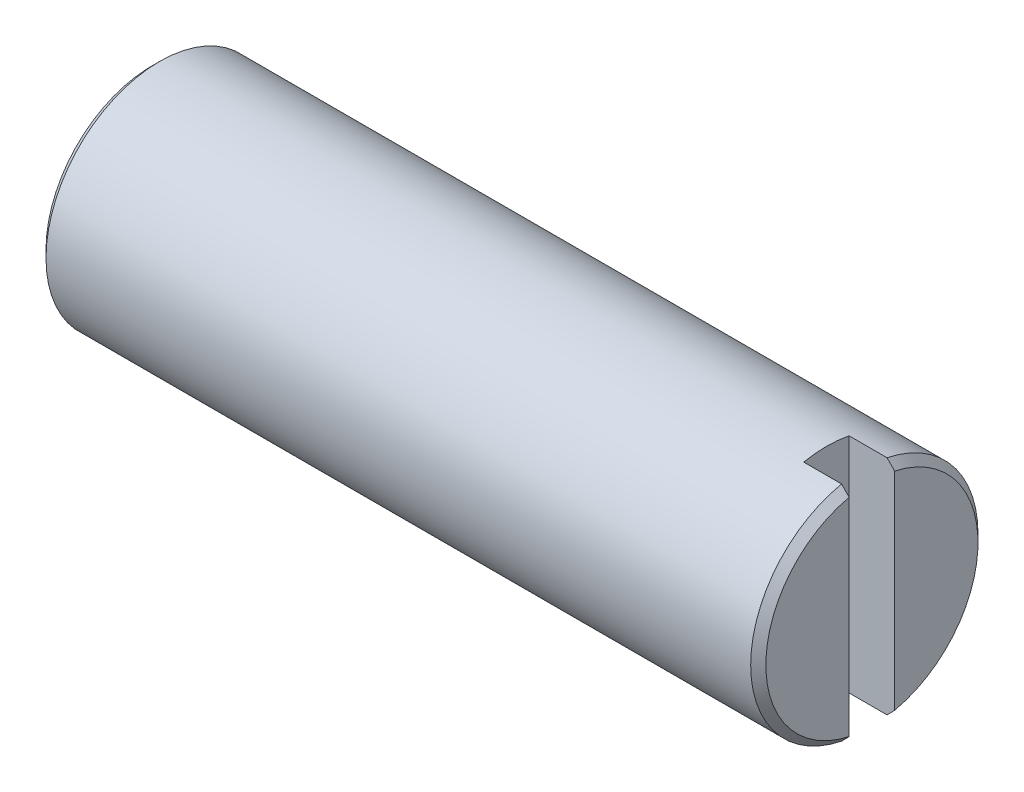
ISO-10303-21;
HEADER;
FILE_DESCRIPTION(('STEP AP214'),'2;1');
FILE_NAME('part.step','',(''),(''),'','','');
FILE_SCHEMA(('AUTOMOTIVE_DESIGN { 1 0 10303 214 1 1 1 1 }'));
ENDSEC;
DATA;
#1=APPLICATION_CONTEXT('core data for automotive mechanical design processes');
#2=APPLICATION_PROTOCOL_DEFINITION('international standard','automotive_design',2000,#1);
#3=PRODUCT_CONTEXT('',#1,'mechanical');
#4=PRODUCT('Part','Part','',(#3));
#5=PRODUCT_RELATED_PRODUCT_CATEGORY('part','',(#4));
#6=PRODUCT_DEFINITION_FORMATION('','',#4);
#7=PRODUCT_DEFINITION_CONTEXT('part definition',#1,'design');
#8=PRODUCT_DEFINITION('design','',#6,#7);
#9=PRODUCT_DEFINITION_SHAPE('','',#8);
#10=(LENGTH_UNIT() NAMED_UNIT(*) SI_UNIT(.MILLI.,.METRE.));
#11=(NAMED_UNIT(*) PLANE_ANGLE_UNIT() SI_UNIT($,.RADIAN.));
#12=(NAMED_UNIT(*) SI_UNIT($,.STERADIAN.) SOLID_ANGLE_UNIT());
#13=UNCERTAINTY_MEASURE_WITH_UNIT(LENGTH_MEASURE(1.E-05),#10,'distance_accuracy_value','');
#14=(GEOMETRIC_REPRESENTATION_CONTEXT(3) GLOBAL_UNCERTAINTY_ASSIGNED_CONTEXT((#13)) GLOBAL_UNIT_ASSIGNED_CONTEXT((#10,
#11,#12)) REPRESENTATION_CONTEXT('',''));
#15=CARTESIAN_POINT('',(0.,0.,0.));
#16=DIRECTION('',(0.,0.,1.));
#17=DIRECTION('',(1.,0.,0.));
#18=AXIS2_PLACEMENT_3D('',#15,#16,#17);
#19=CARTESIAN_POINT('',(0.,-13.674794331177,-65.3333333333324));
#20=DIRECTION('',(1.,0.,0.));
#21=DIRECTION('',(0.,1.,0.));
#22=AXIS2_PLACEMENT_3D('',#19,#20,#21);
#23=PLANE('',#22);
#24=CARTESIAN_POINT('',(0.,0.,0.));
#25=DIRECTION('',(-1.,0.,0.));
#26=DIRECTION('',(0.,0.,1.));
#27=AXIS2_PLACEMENT_3D('',#24,#25,#26);
#28=CIRCLE('',#27,14.);
#29=CARTESIAN_POINT('',(0.,-13.6747943311773,-3.));
#30=VERTEX_POINT('',#29);
#31=CARTESIAN_POINT('',(0.,13.6747943311774,-3.));
#32=VERTEX_POINT('',#31);
#33=EDGE_CURVE('E21',#30,#32,#28,.F.);
#34=ORIENTED_EDGE('',*,*,#33,.T.);
#35=DIRECTION('',(0.,-1.,0.));
#36=VECTOR('',#35,1.);
#37=CARTESIAN_POINT('',(0.,0.,-3.));
#38=LINE('',#37,#36);
#39=EDGE_CURVE('E74',#32,#30,#38,.T.);
#40=ORIENTED_EDGE('',*,*,#39,.T.);
#41=EDGE_LOOP('',(#34,#40));
#42=FACE_BOUND('',#41,.T.);
#43=ADVANCED_FACE('F17',(#42),#23,.T.);
#44=CARTESIAN_POINT('',(-95.,14.,-14.));
#45=DIRECTION('',(-1.,0.,0.));
#46=DIRECTION('',(0.,-1.,0.));
#47=AXIS2_PLACEMENT_3D('',#44,#45,#46);
#48=PLANE('',#47);
#49=CARTESIAN_POINT('',(-95.,0.,0.));
#50=DIRECTION('',(1.,0.,0.));
#51=DIRECTION('',(0.,0.,-1.));
#52=AXIS2_PLACEMENT_3D('',#49,#50,#51);
#53=CIRCLE('',#52,14.);
#54=CARTESIAN_POINT('',(-95.,0.,-14.));
#55=VERTEX_POINT('',#54);
#56=EDGE_CURVE('E84',#55,#55,#53,.F.);
#57=ORIENTED_EDGE('',*,*,#56,.T.);
#58=EDGE_LOOP('',(#57));
#59=FACE_BOUND('',#58,.T.);
#60=ADVANCED_FACE('F125',(#59),#48,.T.);
#61=CARTESIAN_POINT('',(-1.,0.,0.));
#62=DIRECTION('',(-1.,0.,0.));
#63=DIRECTION('',(0.,0.,1.));
#64=AXIS2_PLACEMENT_3D('',#61,#62,#63);
#65=CONICAL_SURFACE('',#64,15.,0.785398163397448);
#66=CARTESIAN_POINT('',(-1.,0.,0.));
#67=DIRECTION('',(1.,0.,0.));
#68=DIRECTION('',(0.,1.,0.));
#69=AXIS2_PLACEMENT_3D('',#66,#67,#68);
#70=CIRCLE('',#69,15.);
#71=CARTESIAN_POINT('',(-1.,-14.6969384566991,-2.99999999999982));
#72=VERTEX_POINT('',#71);
#73=CARTESIAN_POINT('',(-1.,14.6969384566991,-2.99999999999967));
#74=VERTEX_POINT('',#73);
#75=EDGE_CURVE('E80',#72,#74,#70,.T.);
#76=ORIENTED_EDGE('',*,*,#75,.T.);
#77=CARTESIAN_POINT('',(-1.00000000000002,14.6969384566991,-3.));
#78=CARTESIAN_POINT('',(-0.910685704685614,14.6057823417422,-3.00000000000001));
#79=CARTESIAN_POINT('',(-0.82138828392745,14.5146096913895,-3.));
#80=CARTESIAN_POINT('',(-0.645449320404261,14.3349053589284,-2.99999999999999));
#81=CARTESIAN_POINT('',(-0.558806740525136,14.2463746921933,-2.99999999999998));
#82=CARTESIAN_POINT('',(-0.314727054602307,13.9968754230762,-2.99999999999995));
#83=CARTESIAN_POINT('',(-0.157331107545278,13.8358665552257,-2.99999999999995));
#84=CARTESIAN_POINT('',(0.,13.6747943311774,-3.));
#85=B_SPLINE_CURVE_WITH_KNOTS('',3,(#77,#78,#79,#80,#81,#82,#83,#84),.UNSPECIFIED.,.F.,.F.,(4,2,
2,4),(0.,0.382855489103944,0.754475635912759,1.42995767720664),.UNSPECIFIED.);
#86=EDGE_CURVE('E77',#74,#32,#85,.T.);
#87=ORIENTED_EDGE('',*,*,#86,.T.);
#88=ORIENTED_EDGE('',*,*,#33,.F.);
#89=CARTESIAN_POINT('',(0.,-13.6747943311773,-3.));
#90=CARTESIAN_POINT('',(-0.105754917596901,-13.7830640891764,-2.99999999999999));
#91=CARTESIAN_POINT('',(-0.211539195274328,-13.8913051625083,-2.99999999999999));
#92=CARTESIAN_POINT('',(-0.403944025355583,-14.0880782550585,-2.99999999999999));
#93=CARTESIAN_POINT('',(-0.490555477251326,-14.1766191727337,-2.99999999999999));
#94=CARTESIAN_POINT('',(-0.718078151809535,-14.4091186551969,-3.));
#95=CARTESIAN_POINT('',(-0.859018106565691,-14.5530491045672,-3.));
#96=CARTESIAN_POINT('',(-1.00000000000001,-14.6969384566991,-3.));
#97=B_SPLINE_CURVE_WITH_KNOTS('',3,(#89,#90,#91,#92,#93,#94,#95,#96),.UNSPECIFIED.,.F.,.F.,(4,2,
2,4),(0.,0.454046226200915,0.82562304497188,1.4299576813738),.UNSPECIFIED.);
#98=EDGE_CURVE('E68',#30,#72,#97,.T.);
#99=ORIENTED_EDGE('',*,*,#98,.T.);
#100=EDGE_LOOP('',(#76,#87,#88,#99));
#101=FACE_BOUND('',#100,.T.);
#102=ADVANCED_FACE('F78',(#101),#65,.T.);
#103=CARTESIAN_POINT('',(0.,-14.696938456699,-3.));
#104=DIRECTION('',(0.,0.,-1.));
#105=DIRECTION('',(-1.,0.,0.));
#106=AXIS2_PLACEMENT_3D('',#103,#104,#105);
#107=PLANE('',#106);
#108=ORIENTED_EDGE('',*,*,#86,.F.);
#109=DIRECTION('',(-1.,0.,0.));
#110=VECTOR('',#109,1.);
#111=CARTESIAN_POINT('',(-47.5,14.6969384566992,-2.99999999999934));
#112=LINE('',#111,#110);
#113=CARTESIAN_POINT('',(-6.00000000000046,14.6969384566991,-2.99999999999967));
#114=VERTEX_POINT('',#113);
#115=EDGE_CURVE('E167',#74,#114,#112,.T.);
#116=ORIENTED_EDGE('',*,*,#115,.T.);
#117=DIRECTION('',(0.,-1.,0.));
#118=VECTOR('',#117,1.);
#119=CARTESIAN_POINT('',(-6.,-0.154655446197001,-3.));
#120=LINE('',#119,#118);
#121=CARTESIAN_POINT('',(-6.00000000000023,-14.6969384566991,-2.99999999999991));
#122=VERTEX_POINT('',#121);
#123=EDGE_CURVE('E87',#114,#122,#120,.T.);
#124=ORIENTED_EDGE('',*,*,#123,.T.);
#125=DIRECTION('',(1.,0.,0.));
#126=VECTOR('',#125,1.);
#127=CARTESIAN_POINT('',(-47.5,-14.6969384566991,-2.99999999999964));
#128=LINE('',#127,#126);
#129=EDGE_CURVE('E91',#122,#72,#128,.T.);
#130=ORIENTED_EDGE('',*,*,#129,.T.);
#131=ORIENTED_EDGE('',*,*,#98,.F.);
#132=ORIENTED_EDGE('',*,*,#39,.F.);
#133=EDGE_LOOP('',(#108,#116,#124,#130,#131,#132));
#134=FACE_BOUND('',#133,.T.);
#135=ADVANCED_FACE('F83',(#134),#107,.F.);
#136=CARTESIAN_POINT('',(-95.,0.,0.));
#137=DIRECTION('',(1.,0.,0.));
#138=DIRECTION('',(0.,0.,-1.));
#139=AXIS2_PLACEMENT_3D('',#136,#137,#138);
#140=CONICAL_SURFACE('',#139,14.,0.785398163397447);
#141=ORIENTED_EDGE('',*,*,#56,.F.);
#142=EDGE_LOOP('',(#141));
#143=FACE_BOUND('',#142,.T.);
#144=CARTESIAN_POINT('',(-94.,0.,0.));
#145=DIRECTION('',(1.,0.,0.));
#146=DIRECTION('',(0.,1.,0.));
#147=AXIS2_PLACEMENT_3D('',#144,#145,#146);
#148=CIRCLE('',#147,15.);
#149=CARTESIAN_POINT('',(-94.,15.,0.));
#150=VERTEX_POINT('',#149);
#151=EDGE_CURVE('E176',#150,#150,#148,.F.);
#152=ORIENTED_EDGE('',*,*,#151,.T.);
#153=EDGE_LOOP('',(#152));
#154=FACE_BOUND('',#153,.T.);
#155=ADVANCED_FACE('F120',(#143,#154),#140,.T.);
#156=CARTESIAN_POINT('',(-6.,15.,-3.));
#157=DIRECTION('',(-1.,0.,0.));
#158=DIRECTION('',(0.,-1.,0.));
#159=AXIS2_PLACEMENT_3D('',#156,#157,#158);
#160=PLANE('',#159);
#161=CARTESIAN_POINT('',(-6.00000000000046,0.,0.));
#162=DIRECTION('',(1.,0.,0.));
#163=DIRECTION('',(0.,0.,-1.));
#164=AXIS2_PLACEMENT_3D('',#161,#162,#163);
#165=CIRCLE('',#164,15.);
#166=CARTESIAN_POINT('',(-6.0000000000002,14.696938456699,3.));
#167=VERTEX_POINT('',#166);
#168=EDGE_CURVE('E168',#114,#167,#165,.T.);
#169=ORIENTED_EDGE('',*,*,#168,.T.);
#170=DIRECTION('',(0.,-1.,0.));
#171=VECTOR('',#170,1.);
#172=CARTESIAN_POINT('',(-5.99999999999993,0.,3.));
#173=LINE('',#172,#171);
#174=CARTESIAN_POINT('',(-6.0000000000002,-14.696938456699,3.));
#175=VERTEX_POINT('',#174);
#176=EDGE_CURVE('E161',#167,#175,#173,.T.);
#177=ORIENTED_EDGE('',*,*,#176,.T.);
#178=CARTESIAN_POINT('',(-6.00000000000046,0.,0.));
#179=DIRECTION('',(1.,0.,0.));
#180=DIRECTION('',(0.,0.,-1.));
#181=AXIS2_PLACEMENT_3D('',#178,#179,#180);
#182=CIRCLE('',#181,15.);
#183=EDGE_CURVE('E169',#175,#122,#182,.T.);
#184=ORIENTED_EDGE('',*,*,#183,.T.);
#185=ORIENTED_EDGE('',*,*,#123,.F.);
#186=EDGE_LOOP('',(#169,#177,#184,#185));
#187=FACE_BOUND('',#186,.T.);
#188=ADVANCED_FACE('F115',(#187),#160,.F.);
#189=CARTESIAN_POINT('',(-94.,0.,0.));
#190=DIRECTION('',(1.,0.,0.));
#191=DIRECTION('',(0.,0.,-1.));
#192=AXIS2_PLACEMENT_3D('',#189,#190,#191);
#193=CYLINDRICAL_SURFACE('',#192,15.);
#194=ORIENTED_EDGE('',*,*,#151,.F.);
#195=EDGE_LOOP('',(#194));
#196=FACE_BOUND('',#195,.T.);
#197=DIRECTION('',(-1.,0.,0.));
#198=VECTOR('',#197,1.);
#199=CARTESIAN_POINT('',(-14.696938456699,14.696938456699,3.));
#200=LINE('',#199,#198);
#201=CARTESIAN_POINT('',(-1.,14.696938456699,3.));
#202=VERTEX_POINT('',#201);
#203=EDGE_CURVE('E157',#202,#167,#200,.T.);
#204=ORIENTED_EDGE('',*,*,#203,.T.);
#205=ORIENTED_EDGE('',*,*,#168,.F.);
#206=ORIENTED_EDGE('',*,*,#115,.F.);
#207=ORIENTED_EDGE('',*,*,#75,.F.);
#208=ORIENTED_EDGE('',*,*,#129,.F.);
#209=ORIENTED_EDGE('',*,*,#183,.F.);
#210=DIRECTION('',(1.,0.,0.));
#211=VECTOR('',#210,1.);
#212=CARTESIAN_POINT('',(-14.696938456699,-14.696938456699,3.));
#213=LINE('',#212,#211);
#214=CARTESIAN_POINT('',(-0.999999999999966,-14.696938456699,3.));
#215=VERTEX_POINT('',#214);
#216=EDGE_CURVE('E100',#175,#215,#213,.T.);
#217=ORIENTED_EDGE('',*,*,#216,.T.);
#218=CARTESIAN_POINT('',(-1.,0.,0.));
#219=DIRECTION('',(1.,0.,0.));
#220=DIRECTION('',(0.,1.,0.));
#221=AXIS2_PLACEMENT_3D('',#218,#219,#220);
#222=CIRCLE('',#221,15.);
#223=EDGE_CURVE('E156',#215,#202,#222,.F.);
#224=ORIENTED_EDGE('',*,*,#223,.T.);
#225=EDGE_LOOP('',(#204,#205,#206,#207,#208,#209,#217,#224));
#226=FACE_BOUND('',#225,.T.);
#227=ADVANCED_FACE('F119',(#196,#226),#193,.T.);
#228=CARTESIAN_POINT('',(-1.,0.,0.));
#229=DIRECTION('',(-1.,0.,0.));
#230=DIRECTION('',(0.,0.,1.));
#231=AXIS2_PLACEMENT_3D('',#228,#229,#230);
#232=CONICAL_SURFACE('',#231,15.,0.785398163397448);
#233=ORIENTED_EDGE('',*,*,#223,.F.);
#234=CARTESIAN_POINT('',(-0.999999999999991,-14.6969384566991,3.));
#235=CARTESIAN_POINT('',(-0.910685704685593,-14.6057823417422,3.00000000000001));
#236=CARTESIAN_POINT('',(-0.821388283927437,-14.5146096913895,3.00000000000001));
#237=CARTESIAN_POINT('',(-0.645449320404259,-14.3349053589284,2.99999999999999));
#238=CARTESIAN_POINT('',(-0.558806740525136,-14.2463746921933,2.99999999999998));
#239=CARTESIAN_POINT('',(-0.314727054602278,-13.9968754230761,2.99999999999995));
#240=CARTESIAN_POINT('',(-0.157331107545219,-13.8358665552256,2.99999999999994));
#241=CARTESIAN_POINT('',(0.,-13.6747943311773,3.));
#242=B_SPLINE_CURVE_WITH_KNOTS('',3,(#234,#235,#236,#237,#238,#239,#240,#241),.UNSPECIFIED.,.F.,
.F.,(4,2,2,4),(0.,0.382855489103902,0.754475635912718,1.42995767720674),.UNSPECIFIED.);
#243=CARTESIAN_POINT('',(0.,-13.6747943311773,3.00000000000004));
#244=VERTEX_POINT('',#243);
#245=EDGE_CURVE('E36',#215,#244,#242,.T.);
#246=ORIENTED_EDGE('',*,*,#245,.T.);
#247=CARTESIAN_POINT('',(0.,0.,0.));
#248=DIRECTION('',(-1.,0.,0.));
#249=DIRECTION('',(0.,0.,1.));
#250=AXIS2_PLACEMENT_3D('',#247,#248,#249);
#251=CIRCLE('',#250,14.);
#252=CARTESIAN_POINT('',(0.,13.6747943311774,3.00000000000004));
#253=VERTEX_POINT('',#252);
#254=EDGE_CURVE('E27',#253,#244,#251,.F.);
#255=ORIENTED_EDGE('',*,*,#254,.F.);
#256=CARTESIAN_POINT('',(0.,13.6747943311774,3.));
#257=CARTESIAN_POINT('',(-0.105754917596945,13.7830640891765,3.));
#258=CARTESIAN_POINT('',(-0.21153919527435,13.8913051625083,2.99999999999999));
#259=CARTESIAN_POINT('',(-0.403944025355583,14.0880782550585,2.99999999999999));
#260=CARTESIAN_POINT('',(-0.490555477251327,14.1766191727337,2.99999999999999));
#261=CARTESIAN_POINT('',(-0.718078151809527,14.4091186551969,2.99999999999999));
#262=CARTESIAN_POINT('',(-0.859018106565674,14.5530491045672,3.));
#263=CARTESIAN_POINT('',(-0.999999999999977,14.696938456699,3.));
#264=B_SPLINE_CURVE_WITH_KNOTS('',3,(#256,#257,#258,#259,#260,#261,#262,#263),.UNSPECIFIED.,.F.,
.F.,(4,2,2,4),(0.,0.454046226200817,0.825623044971779,1.42995768137366),.UNSPECIFIED.);
#265=EDGE_CURVE('E101',#253,#202,#264,.T.);
#266=ORIENTED_EDGE('',*,*,#265,.T.);
#267=EDGE_LOOP('',(#233,#246,#255,#266));
#268=FACE_BOUND('',#267,.T.);
#269=ADVANCED_FACE('F106',(#268),#232,.T.);
#270=CARTESIAN_POINT('',(0.,14.696938456699,3.));
#271=DIRECTION('',(0.,0.,1.));
#272=DIRECTION('',(-1.,0.,0.));
#273=AXIS2_PLACEMENT_3D('',#270,#271,#272);
#274=PLANE('',#273);
#275=ORIENTED_EDGE('',*,*,#245,.F.);
#276=ORIENTED_EDGE('',*,*,#216,.F.);
#277=ORIENTED_EDGE('',*,*,#176,.F.);
#278=ORIENTED_EDGE('',*,*,#203,.F.);
#279=ORIENTED_EDGE('',*,*,#265,.F.);
#280=DIRECTION('',(0.,1.,0.));
#281=VECTOR('',#280,1.);
#282=CARTESIAN_POINT('',(0.,0.325205668822999,3.00000000000008));
#283=LINE('',#282,#281);
#284=EDGE_CURVE('E11',#244,#253,#283,.T.);
#285=ORIENTED_EDGE('',*,*,#284,.F.);
#286=EDGE_LOOP('',(#275,#276,#277,#278,#279,#285));
#287=FACE_BOUND('',#286,.T.);
#288=ADVANCED_FACE('F110',(#287),#274,.F.);
#289=CARTESIAN_POINT('',(0.,-13.674794331177,-14.));
#290=DIRECTION('',(1.,0.,0.));
#291=DIRECTION('',(0.,1.,0.));
#292=AXIS2_PLACEMENT_3D('',#289,#290,#291);
#293=PLANE('',#292);
#294=ORIENTED_EDGE('',*,*,#254,.T.);
#295=ORIENTED_EDGE('',*,*,#284,.T.);
#296=EDGE_LOOP('',(#294,#295));
#297=FACE_BOUND('',#296,.T.);
#298=ADVANCED_FACE('F19',(#297),#293,.T.);
#299=CLOSED_SHELL('',(#43,#60,#102,#135,#155,#188,#227,#269,#288,#298));
#300=MANIFOLD_SOLID_BREP('B1',#299);
#301=ADVANCED_BREP_SHAPE_REPRESENTATION('',(#18,#300),#14);
#302=SHAPE_DEFINITION_REPRESENTATION(#9,#301);
ENDSEC;
END-ISO-10303-21;
